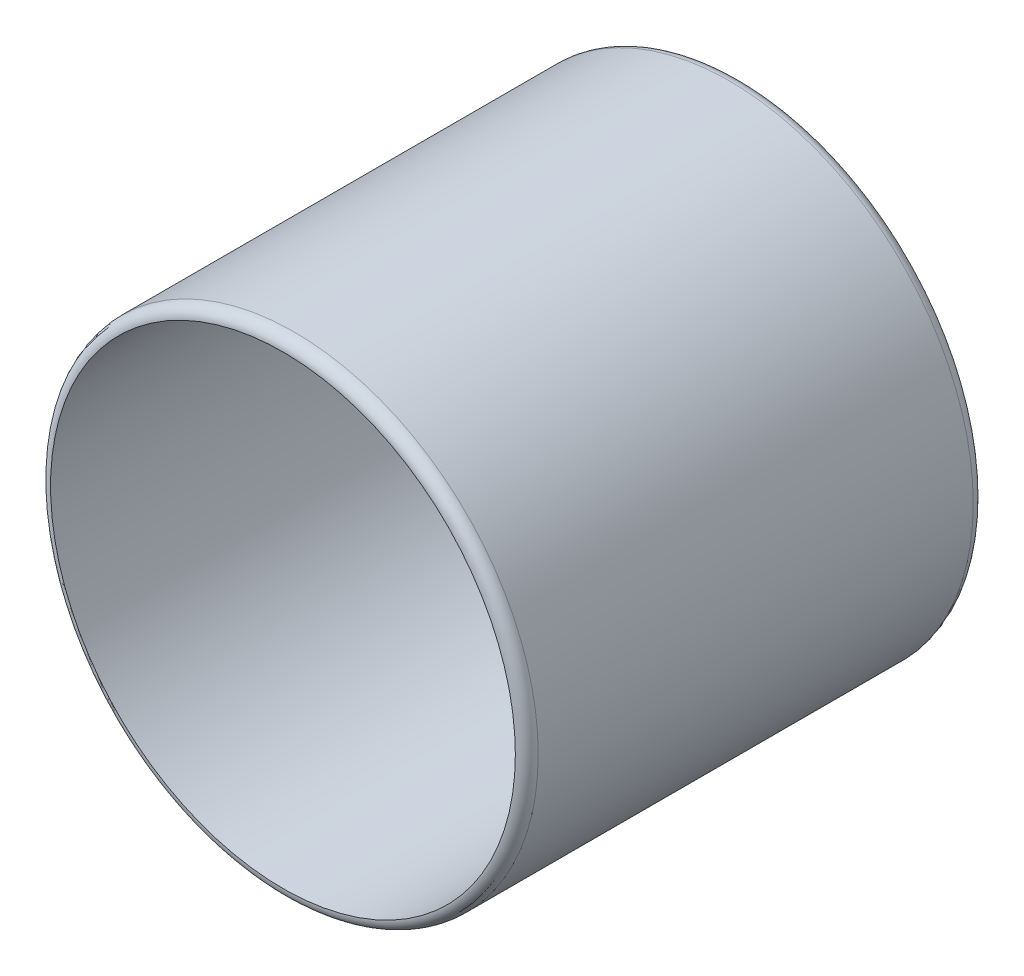
ISO-10303-21;
HEADER;
FILE_DESCRIPTION(('STEP AP214'),'2;1');
FILE_NAME('part.step','',(''),(''),'','','');
FILE_SCHEMA(('AUTOMOTIVE_DESIGN { 1 0 10303 214 1 1 1 1 }'));
ENDSEC;
DATA;
#1=APPLICATION_CONTEXT('core data for automotive mechanical design processes');
#2=APPLICATION_PROTOCOL_DEFINITION('international standard','automotive_design',2000,#1);
#3=PRODUCT_CONTEXT('',#1,'mechanical');
#4=PRODUCT('Part','Part','',(#3));
#5=PRODUCT_RELATED_PRODUCT_CATEGORY('part','',(#4));
#6=PRODUCT_DEFINITION_FORMATION('','',#4);
#7=PRODUCT_DEFINITION_CONTEXT('part definition',#1,'design');
#8=PRODUCT_DEFINITION('design','',#6,#7);
#9=PRODUCT_DEFINITION_SHAPE('','',#8);
#10=(LENGTH_UNIT() NAMED_UNIT(*) SI_UNIT(.MILLI.,.METRE.));
#11=(NAMED_UNIT(*) PLANE_ANGLE_UNIT() SI_UNIT($,.RADIAN.));
#12=(NAMED_UNIT(*) SI_UNIT($,.STERADIAN.) SOLID_ANGLE_UNIT());
#13=UNCERTAINTY_MEASURE_WITH_UNIT(LENGTH_MEASURE(1.E-05),#10,'distance_accuracy_value','');
#14=(GEOMETRIC_REPRESENTATION_CONTEXT(3) GLOBAL_UNCERTAINTY_ASSIGNED_CONTEXT((#13)) GLOBAL_UNIT_ASSIGNED_CONTEXT((#10,
#11,#12)) REPRESENTATION_CONTEXT('',''));
#15=CARTESIAN_POINT('',(0.,0.,0.));
#16=DIRECTION('',(0.,0.,1.));
#17=DIRECTION('',(1.,0.,0.));
#18=AXIS2_PLACEMENT_3D('',#15,#16,#17);
#19=CARTESIAN_POINT('',(0.,0.,400.));
#20=DIRECTION('',(0.,0.,-1.));
#21=DIRECTION('',(-1.,0.,0.));
#22=AXIS2_PLACEMENT_3D('',#19,#20,#21);
#23=CYLINDRICAL_SURFACE('',#22,213.);
#24=CARTESIAN_POINT('',(0.,0.,10.));
#25=DIRECTION('',(0.,0.,1.));
#26=DIRECTION('',(1.,0.,0.));
#27=AXIS2_PLACEMENT_3D('',#24,#25,#26);
#28=CIRCLE('',#27,213.);
#29=CARTESIAN_POINT('',(213.,0.,10.));
#30=VERTEX_POINT('',#29);
#31=EDGE_CURVE('E11',#30,#30,#28,.T.);
#32=ORIENTED_EDGE('',*,*,#31,.T.);
#33=EDGE_LOOP('',(#32));
#34=FACE_BOUND('',#33,.T.);
#35=CARTESIAN_POINT('',(0.,0.,390.));
#36=DIRECTION('',(0.,0.,1.));
#37=DIRECTION('',(1.,0.,0.));
#38=AXIS2_PLACEMENT_3D('',#35,#36,#37);
#39=CIRCLE('',#38,213.);
#40=CARTESIAN_POINT('',(213.,0.,390.));
#41=VERTEX_POINT('',#40);
#42=EDGE_CURVE('E47',#41,#41,#39,.F.);
#43=ORIENTED_EDGE('',*,*,#42,.T.);
#44=EDGE_LOOP('',(#43));
#45=FACE_BOUND('',#44,.T.);
#46=ADVANCED_FACE('F40',(#34,#45),#23,.T.);
#47=CARTESIAN_POINT('',(0.,0.,400.));
#48=DIRECTION('',(0.,0.,-1.));
#49=DIRECTION('',(-1.,0.,0.));
#50=AXIS2_PLACEMENT_3D('',#47,#48,#49);
#51=CYLINDRICAL_SURFACE('',#50,203.);
#52=CARTESIAN_POINT('',(0.,0.,400.));
#53=DIRECTION('',(0.,0.,1.));
#54=DIRECTION('',(1.,0.,0.));
#55=AXIS2_PLACEMENT_3D('',#52,#53,#54);
#56=CIRCLE('',#55,203.);
#57=CARTESIAN_POINT('',(203.,0.,400.));
#58=VERTEX_POINT('',#57);
#59=EDGE_CURVE('E51',#58,#58,#56,.T.);
#60=ORIENTED_EDGE('',*,*,#59,.T.);
#61=EDGE_LOOP('',(#60));
#62=FACE_BOUND('',#61,.T.);
#63=CARTESIAN_POINT('',(0.,0.,0.));
#64=DIRECTION('',(0.,0.,1.));
#65=DIRECTION('',(1.,0.,0.));
#66=AXIS2_PLACEMENT_3D('',#63,#64,#65);
#67=CIRCLE('',#66,203.);
#68=CARTESIAN_POINT('',(203.,0.,0.));
#69=VERTEX_POINT('',#68);
#70=EDGE_CURVE('E55',#69,#69,#67,.T.);
#71=ORIENTED_EDGE('',*,*,#70,.F.);
#72=EDGE_LOOP('',(#71));
#73=FACE_BOUND('',#72,.T.);
#74=ADVANCED_FACE('F64',(#62,#73),#51,.F.);
#75=CARTESIAN_POINT('',(0.,0.,10.));
#76=DIRECTION('',(0.,0.,1.));
#77=DIRECTION('',(1.,0.,0.));
#78=AXIS2_PLACEMENT_3D('',#75,#76,#77);
#79=TOROIDAL_SURFACE('',#78,203.,10.);
#80=ORIENTED_EDGE('',*,*,#70,.T.);
#81=EDGE_LOOP('',(#80));
#82=FACE_BOUND('',#81,.T.);
#83=ORIENTED_EDGE('',*,*,#31,.F.);
#84=EDGE_LOOP('',(#83));
#85=FACE_BOUND('',#84,.T.);
#86=ADVANCED_FACE('F61',(#82,#85),#79,.T.);
#87=CARTESIAN_POINT('',(0.,0.,390.));
#88=DIRECTION('',(0.,0.,1.));
#89=DIRECTION('',(1.,0.,0.));
#90=AXIS2_PLACEMENT_3D('',#87,#88,#89);
#91=TOROIDAL_SURFACE('',#90,203.,10.);
#92=ORIENTED_EDGE('',*,*,#42,.F.);
#93=EDGE_LOOP('',(#92));
#94=FACE_BOUND('',#93,.T.);
#95=ORIENTED_EDGE('',*,*,#59,.F.);
#96=EDGE_LOOP('',(#95));
#97=FACE_BOUND('',#96,.T.);
#98=ADVANCED_FACE('F42',(#94,#97),#91,.T.);
#99=CLOSED_SHELL('',(#46,#74,#86,#98));
#100=MANIFOLD_SOLID_BREP('B2',#99);
#101=ADVANCED_BREP_SHAPE_REPRESENTATION('',(#18,#100),#14);
#102=SHAPE_DEFINITION_REPRESENTATION(#9,#101);
ENDSEC;
END-ISO-10303-21;
